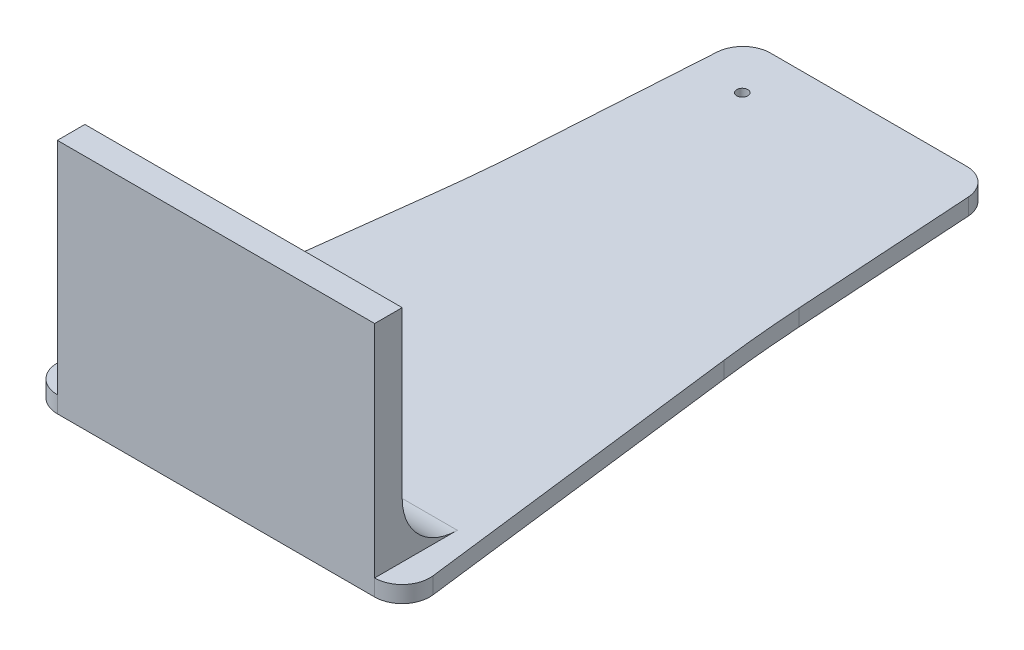
ISO-10303-21;
HEADER;
FILE_DESCRIPTION(('STEP AP214'),'2;1');
FILE_NAME('part.step','',(''),(''),'','','');
FILE_SCHEMA(('AUTOMOTIVE_DESIGN { 1 0 10303 214 1 1 1 1 }'));
ENDSEC;
DATA;
#1=APPLICATION_CONTEXT('core data for automotive mechanical design processes');
#2=APPLICATION_PROTOCOL_DEFINITION('international standard','automotive_design',2000,#1);
#3=PRODUCT_CONTEXT('',#1,'mechanical');
#4=PRODUCT('Part','Part','',(#3));
#5=PRODUCT_RELATED_PRODUCT_CATEGORY('part','',(#4));
#6=PRODUCT_DEFINITION_FORMATION('','',#4);
#7=PRODUCT_DEFINITION_CONTEXT('part definition',#1,'design');
#8=PRODUCT_DEFINITION('design','',#6,#7);
#9=PRODUCT_DEFINITION_SHAPE('','',#8);
#10=(LENGTH_UNIT() NAMED_UNIT(*) SI_UNIT(.MILLI.,.METRE.));
#11=(NAMED_UNIT(*) PLANE_ANGLE_UNIT() SI_UNIT($,.RADIAN.));
#12=(NAMED_UNIT(*) SI_UNIT($,.STERADIAN.) SOLID_ANGLE_UNIT());
#13=UNCERTAINTY_MEASURE_WITH_UNIT(LENGTH_MEASURE(1.E-05),#10,'distance_accuracy_value','');
#14=(GEOMETRIC_REPRESENTATION_CONTEXT(3) GLOBAL_UNCERTAINTY_ASSIGNED_CONTEXT((#13)) GLOBAL_UNIT_ASSIGNED_CONTEXT((#10,
#11,#12)) REPRESENTATION_CONTEXT('',''));
#15=CARTESIAN_POINT('',(0.,0.,0.));
#16=DIRECTION('',(0.,0.,1.));
#17=DIRECTION('',(1.,0.,0.));
#18=AXIS2_PLACEMENT_3D('',#15,#16,#17);
#19=CARTESIAN_POINT('',(-30.,3.,30.));
#20=DIRECTION('',(0.992397243349406,0.,0.123076039067315));
#21=DIRECTION('',(0.123076039067315,0.,-0.992397243349406));
#22=AXIS2_PLACEMENT_3D('',#19,#20,#21);
#23=PLANE('',#22);
#24=DIRECTION('',(-0.123076039067315,0.,0.992397243349406));
#25=VECTOR('',#24,1.);
#26=CARTESIAN_POINT('',(-30.,0.,30.));
#27=LINE('',#26,#25);
#28=CARTESIAN_POINT('',(-26.2750358818193,0.,-0.0354492269295376));
#29=VERTEX_POINT('',#28);
#30=CARTESIAN_POINT('',(-33.7621348966456,0.,60.3351678265958));
#31=VERTEX_POINT('',#30);
#32=EDGE_CURVE('E181',#29,#31,#27,.T.);
#33=ORIENTED_EDGE('',*,*,#32,.T.);
#34=DIRECTION('',(0.,-1.,0.));
#35=VECTOR('',#34,1.);
#36=CARTESIAN_POINT('',(-33.7621348966456,3.,60.3351678265958));
#37=LINE('',#36,#35);
#38=CARTESIAN_POINT('',(-33.7621348966459,3.,60.3351678265957));
#39=VERTEX_POINT('',#38);
#40=EDGE_CURVE('E261',#31,#39,#37,.F.);
#41=ORIENTED_EDGE('',*,*,#40,.T.);
#42=DIRECTION('',(-0.123076039067326,0.,0.992397243349405));
#43=VECTOR('',#42,1.);
#44=CARTESIAN_POINT('',(-25.3492903210335,3.,-7.50000000000001));
#45=LINE('',#44,#43);
#46=CARTESIAN_POINT('',(-26.275035881819,3.,-0.0354492269294959));
#47=VERTEX_POINT('',#46);
#48=EDGE_CURVE('E183',#47,#39,#45,.T.);
#49=ORIENTED_EDGE('',*,*,#48,.F.);
#50=DIRECTION('',(0.,-1.,0.));
#51=VECTOR('',#50,1.);
#52=CARTESIAN_POINT('',(-26.2750358818193,0.,-0.0354492269295371));
#53=LINE('',#52,#51);
#54=EDGE_CURVE('E217',#47,#29,#53,.T.);
#55=ORIENTED_EDGE('',*,*,#54,.T.);
#56=EDGE_LOOP('',(#33,#41,#49,#55));
#57=FACE_BOUND('',#56,.T.);
#58=ADVANCED_FACE('F37',(#57),#23,.F.);
#59=CARTESIAN_POINT('',(-30.,3.,65.9505480219323));
#60=DIRECTION('',(0.,0.,-1.));
#61=DIRECTION('',(-1.,0.,0.));
#62=AXIS2_PLACEMENT_3D('',#59,#60,#61);
#63=PLANE('',#62);
#64=DIRECTION('',(0.,-1.,0.));
#65=VECTOR('',#64,1.);
#66=CARTESIAN_POINT('',(28.8001486798989,3.,65.9505480219323));
#67=LINE('',#66,#65);
#68=CARTESIAN_POINT('',(28.8001486798989,0.,65.9505480219323));
#69=VERTEX_POINT('',#68);
#70=CARTESIAN_POINT('',(28.8001486798989,3.,65.9505480219323));
#71=VERTEX_POINT('',#70);
#72=EDGE_CURVE('E257',#69,#71,#67,.F.);
#73=ORIENTED_EDGE('',*,*,#72,.T.);
#74=DIRECTION('',(0.,-1.,0.));
#75=VECTOR('',#74,1.);
#76=CARTESIAN_POINT('',(28.8001486798989,43.,65.9505480219325));
#77=LINE('',#76,#75);
#78=CARTESIAN_POINT('',(28.8001486798989,43.,65.9505480219325));
#79=VERTEX_POINT('',#78);
#80=EDGE_CURVE('E156',#79,#71,#77,.T.);
#81=ORIENTED_EDGE('',*,*,#80,.F.);
#82=DIRECTION('',(1.,0.,0.));
#83=VECTOR('',#82,1.);
#84=CARTESIAN_POINT('',(-28.8001486798985,43.,65.9505480219325));
#85=LINE('',#84,#83);
#86=CARTESIAN_POINT('',(-28.8001486798985,43.,65.9505480219325));
#87=VERTEX_POINT('',#86);
#88=EDGE_CURVE('E149',#87,#79,#85,.T.);
#89=ORIENTED_EDGE('',*,*,#88,.F.);
#90=DIRECTION('',(0.,-1.,0.));
#91=VECTOR('',#90,1.);
#92=CARTESIAN_POINT('',(-28.8001486798985,43.,65.9505480219325));
#93=LINE('',#92,#91);
#94=CARTESIAN_POINT('',(-28.8001486798985,3.,65.9505480219323));
#95=VERTEX_POINT('',#94);
#96=EDGE_CURVE('E155',#87,#95,#93,.T.);
#97=ORIENTED_EDGE('',*,*,#96,.T.);
#98=DIRECTION('',(0.,-1.,0.));
#99=VECTOR('',#98,1.);
#100=CARTESIAN_POINT('',(-28.8001486798985,3.,65.9505480219323));
#101=LINE('',#100,#99);
#102=CARTESIAN_POINT('',(-28.8001486798985,0.,65.9505480219323));
#103=VERTEX_POINT('',#102);
#104=EDGE_CURVE('E259',#95,#103,#101,.T.);
#105=ORIENTED_EDGE('',*,*,#104,.T.);
#106=DIRECTION('',(1.,0.,0.));
#107=VECTOR('',#106,1.);
#108=CARTESIAN_POINT('',(-30.,0.,65.9505480219323));
#109=LINE('',#108,#107);
#110=EDGE_CURVE('E200',#103,#69,#109,.T.);
#111=ORIENTED_EDGE('',*,*,#110,.T.);
#112=EDGE_LOOP('',(#73,#81,#89,#97,#105,#111));
#113=FACE_BOUND('',#112,.T.);
#114=ADVANCED_FACE('F152',(#113),#63,.F.);
#115=CARTESIAN_POINT('',(25.3492903210335,3.,-7.50000000000001));
#116=DIRECTION('',(-0.992397243349405,0.,0.123076039067327));
#117=DIRECTION('',(0.123076039067327,0.,0.992397243349405));
#118=AXIS2_PLACEMENT_3D('',#115,#116,#117);
#119=PLANE('',#118);
#120=DIRECTION('',(-0.123076039067328,0.,-0.992397243349405));
#121=VECTOR('',#120,1.);
#122=CARTESIAN_POINT('',(30.,3.,30.));
#123=LINE('',#122,#121);
#124=CARTESIAN_POINT('',(33.762134896646,3.,60.3351678265957));
#125=VERTEX_POINT('',#124);
#126=CARTESIAN_POINT('',(26.2750358818201,3.,-0.035449226920458));
#127=VERTEX_POINT('',#126);
#128=EDGE_CURVE('E186',#125,#127,#123,.T.);
#129=ORIENTED_EDGE('',*,*,#128,.F.);
#130=DIRECTION('',(0.,-1.,0.));
#131=VECTOR('',#130,1.);
#132=CARTESIAN_POINT('',(33.7621348966459,3.,60.3351678265957));
#133=LINE('',#132,#131);
#134=CARTESIAN_POINT('',(33.7621348966459,0.,60.3351678265957));
#135=VERTEX_POINT('',#134);
#136=EDGE_CURVE('E263',#125,#135,#133,.T.);
#137=ORIENTED_EDGE('',*,*,#136,.T.);
#138=DIRECTION('',(-0.123076039067327,0.,-0.992397243349405));
#139=VECTOR('',#138,1.);
#140=CARTESIAN_POINT('',(25.3492903210335,0.,-7.50000000000001));
#141=LINE('',#140,#139);
#142=CARTESIAN_POINT('',(26.2750358818201,0.,-0.0354492269204676));
#143=VERTEX_POINT('',#142);
#144=EDGE_CURVE('E203',#135,#143,#141,.T.);
#145=ORIENTED_EDGE('',*,*,#144,.T.);
#146=DIRECTION('',(0.,-1.,0.));
#147=VECTOR('',#146,1.);
#148=CARTESIAN_POINT('',(26.2750358818201,3.,-0.0354492269204683));
#149=LINE('',#148,#147);
#150=EDGE_CURVE('E214',#143,#127,#149,.F.);
#151=ORIENTED_EDGE('',*,*,#150,.T.);
#152=EDGE_LOOP('',(#129,#137,#145,#151));
#153=FACE_BOUND('',#152,.T.);
#154=ADVANCED_FACE('F311',(#153),#119,.F.);
#155=CARTESIAN_POINT('',(22.5,3.,-52.5));
#156=DIRECTION('',(-0.998001450433273,0.,0.063191019402153));
#157=DIRECTION('',(0.063191019402153,0.,0.998001450433273));
#158=AXIS2_PLACEMENT_3D('',#155,#156,#157);
#159=PLANE('',#158);
#160=DIRECTION('',(-0.0631910194021531,0.,-0.998001450433273));
#161=VECTOR('',#160,1.);
#162=CARTESIAN_POINT('',(22.5,0.,-52.5));
#163=LINE('',#162,#161);
#164=CARTESIAN_POINT('',(24.873984110853,0.,-15.006704143214));
#165=VERTEX_POINT('',#164);
#166=CARTESIAN_POINT('',(22.7965823067861,0.,-47.8159550970108));
#167=VERTEX_POINT('',#166);
#168=EDGE_CURVE('E205',#165,#167,#163,.T.);
#169=ORIENTED_EDGE('',*,*,#168,.T.);
#170=DIRECTION('',(0.,-1.,0.));
#171=VECTOR('',#170,1.);
#172=CARTESIAN_POINT('',(22.7965823067861,3.,-47.8159550970108));
#173=LINE('',#172,#171);
#174=CARTESIAN_POINT('',(22.7965823067861,3.,-47.8159550970108));
#175=VERTEX_POINT('',#174);
#176=EDGE_CURVE('E266',#167,#175,#173,.F.);
#177=ORIENTED_EDGE('',*,*,#176,.T.);
#178=DIRECTION('',(-0.0631910194021531,0.,-0.998001450433273));
#179=VECTOR('',#178,1.);
#180=CARTESIAN_POINT('',(22.5,3.,-52.5));
#181=LINE('',#180,#179);
#182=CARTESIAN_POINT('',(24.873984110853,3.,-15.006704143214));
#183=VERTEX_POINT('',#182);
#184=EDGE_CURVE('E189',#183,#175,#181,.T.);
#185=ORIENTED_EDGE('',*,*,#184,.F.);
#186=DIRECTION('',(0.,-1.,0.));
#187=VECTOR('',#186,1.);
#188=CARTESIAN_POINT('',(24.873984110853,0.,-15.0067041432141));
#189=LINE('',#188,#187);
#190=EDGE_CURVE('E197',#183,#165,#189,.T.);
#191=ORIENTED_EDGE('',*,*,#190,.T.);
#192=EDGE_LOOP('',(#169,#177,#185,#191));
#193=FACE_BOUND('',#192,.T.);
#194=ADVANCED_FACE('F373',(#193),#159,.F.);
#195=CARTESIAN_POINT('',(-22.5,3.,-52.5));
#196=DIRECTION('',(0.,0.,1.));
#197=DIRECTION('',(1.,0.,0.));
#198=AXIS2_PLACEMENT_3D('',#195,#196,#197);
#199=PLANE('',#198);
#200=DIRECTION('',(-1.,0.,0.));
#201=VECTOR('',#200,1.);
#202=CARTESIAN_POINT('',(-22.5,0.,-52.5));
#203=LINE('',#202,#201);
#204=CARTESIAN_POINT('',(17.8065750546197,0.,-52.5));
#205=VERTEX_POINT('',#204);
#206=CARTESIAN_POINT('',(-17.8065750546197,0.,-52.5));
#207=VERTEX_POINT('',#206);
#208=EDGE_CURVE('E208',#205,#207,#203,.T.);
#209=ORIENTED_EDGE('',*,*,#208,.T.);
#210=DIRECTION('',(0.,-1.,0.));
#211=VECTOR('',#210,1.);
#212=CARTESIAN_POINT('',(-17.8065750546197,3.,-52.5));
#213=LINE('',#212,#211);
#214=CARTESIAN_POINT('',(-17.8065750546197,3.,-52.5));
#215=VERTEX_POINT('',#214);
#216=EDGE_CURVE('E247',#207,#215,#213,.F.);
#217=ORIENTED_EDGE('',*,*,#216,.T.);
#218=DIRECTION('',(-1.,0.,0.));
#219=VECTOR('',#218,1.);
#220=CARTESIAN_POINT('',(-22.5,3.,-52.5));
#221=LINE('',#220,#219);
#222=CARTESIAN_POINT('',(17.8065750546197,3.,-52.5));
#223=VERTEX_POINT('',#222);
#224=EDGE_CURVE('E192',#223,#215,#221,.T.);
#225=ORIENTED_EDGE('',*,*,#224,.F.);
#226=DIRECTION('',(0.,-1.,0.));
#227=VECTOR('',#226,1.);
#228=CARTESIAN_POINT('',(17.8065750546197,3.,-52.5));
#229=LINE('',#228,#227);
#230=EDGE_CURVE('E244',#223,#205,#229,.T.);
#231=ORIENTED_EDGE('',*,*,#230,.T.);
#232=EDGE_LOOP('',(#209,#217,#225,#231));
#233=FACE_BOUND('',#232,.T.);
#234=ADVANCED_FACE('F350',(#233),#199,.F.);
#235=CARTESIAN_POINT('',(-22.5,3.,-52.5));
#236=DIRECTION('',(0.998001450433273,0.,0.0631910194021544));
#237=DIRECTION('',(0.0631910194021544,0.,-0.998001450433273));
#238=AXIS2_PLACEMENT_3D('',#235,#236,#237);
#239=PLANE('',#238);
#240=DIRECTION('',(-0.0631910194021544,0.,0.998001450433273));
#241=VECTOR('',#240,1.);
#242=CARTESIAN_POINT('',(-22.5,3.,-52.5));
#243=LINE('',#242,#241);
#244=CARTESIAN_POINT('',(-22.7965823067861,3.,-47.8159550970108));
#245=VERTEX_POINT('',#244);
#246=CARTESIAN_POINT('',(-24.8739841108527,3.,-15.0067041432197));
#247=VERTEX_POINT('',#246);
#248=EDGE_CURVE('E195',#245,#247,#243,.T.);
#249=ORIENTED_EDGE('',*,*,#248,.F.);
#250=DIRECTION('',(0.,-1.,0.));
#251=VECTOR('',#250,1.);
#252=CARTESIAN_POINT('',(-22.7965823067861,3.,-47.8159550970108));
#253=LINE('',#252,#251);
#254=CARTESIAN_POINT('',(-22.7965823067861,0.,-47.8159550970108));
#255=VERTEX_POINT('',#254);
#256=EDGE_CURVE('E233',#245,#255,#253,.T.);
#257=ORIENTED_EDGE('',*,*,#256,.T.);
#258=DIRECTION('',(-0.0631910194021544,0.,0.998001450433273));
#259=VECTOR('',#258,1.);
#260=CARTESIAN_POINT('',(-22.5,0.,-52.5));
#261=LINE('',#260,#259);
#262=CARTESIAN_POINT('',(-24.8739841108527,0.,-15.0067041432197));
#263=VERTEX_POINT('',#262);
#264=EDGE_CURVE('E187',#255,#263,#261,.T.);
#265=ORIENTED_EDGE('',*,*,#264,.T.);
#266=DIRECTION('',(0.,-1.,0.));
#267=VECTOR('',#266,1.);
#268=CARTESIAN_POINT('',(-24.8739841108527,3.,-15.0067041432197));
#269=LINE('',#268,#267);
#270=EDGE_CURVE('E220',#263,#247,#269,.F.);
#271=ORIENTED_EDGE('',*,*,#270,.T.);
#272=EDGE_LOOP('',(#249,#257,#265,#271));
#273=FACE_BOUND('',#272,.T.);
#274=ADVANCED_FACE('F356',(#273),#239,.F.);
#275=CARTESIAN_POINT('',(0.,3.,0.));
#276=DIRECTION('',(0.,1.,0.));
#277=DIRECTION('',(0.,0.,1.));
#278=AXIS2_PLACEMENT_3D('',#275,#276,#277);
#279=PLANE('',#278);
#280=DIRECTION('',(0.,0.,1.));
#281=VECTOR('',#280,1.);
#282=CARTESIAN_POINT('',(-28.8001486798985,3.,65.9505480219325));
#283=LINE('',#282,#281);
#284=CARTESIAN_POINT('',(-28.8001486798985,3.,50.9505480219323));
#285=VERTEX_POINT('',#284);
#286=EDGE_CURVE('E52',#285,#95,#283,.T.);
#287=ORIENTED_EDGE('',*,*,#286,.F.);
#288=DIRECTION('',(-1.,0.,0.));
#289=VECTOR('',#288,1.);
#290=CARTESIAN_POINT('',(0.,3.,50.9505480219323));
#291=LINE('',#290,#289);
#292=CARTESIAN_POINT('',(28.8001486798989,3.,50.9505480219323));
#293=VERTEX_POINT('',#292);
#294=EDGE_CURVE('E271',#285,#293,#291,.F.);
#295=ORIENTED_EDGE('',*,*,#294,.T.);
#296=DIRECTION('',(0.,0.,-1.));
#297=VECTOR('',#296,1.);
#298=CARTESIAN_POINT('',(28.8001486798989,3.,65.9505480219325));
#299=LINE('',#298,#297);
#300=EDGE_CURVE('E59',#71,#293,#299,.T.);
#301=ORIENTED_EDGE('',*,*,#300,.F.);
#302=CARTESIAN_POINT('',(28.8001486798989,3.,60.9505480219323));
#303=DIRECTION('',(0.,1.,0.));
#304=DIRECTION('',(0.,0.,1.));
#305=AXIS2_PLACEMENT_3D('',#302,#303,#304);
#306=CIRCLE('',#305,5.);
#307=EDGE_CURVE('E251',#71,#125,#306,.T.);
#308=ORIENTED_EDGE('',*,*,#307,.T.);
#309=ORIENTED_EDGE('',*,*,#128,.T.);
#310=CARTESIAN_POINT('',(274.374346719171,3.,-30.8044589937523));
#311=DIRECTION('',(0.,1.,0.));
#312=DIRECTION('',(0.,0.,1.));
#313=AXIS2_PLACEMENT_3D('',#310,#311,#312);
#314=CIRCLE('',#313,250.);
#315=EDGE_CURVE('E226',#127,#183,#314,.F.);
#316=ORIENTED_EDGE('',*,*,#315,.T.);
#317=ORIENTED_EDGE('',*,*,#184,.T.);
#318=CARTESIAN_POINT('',(17.8065750546197,3.,-47.5));
#319=DIRECTION('',(0.,1.,0.));
#320=DIRECTION('',(0.,0.,1.));
#321=AXIS2_PLACEMENT_3D('',#318,#319,#320);
#322=CIRCLE('',#321,5.);
#323=EDGE_CURVE('E249',#175,#223,#322,.T.);
#324=ORIENTED_EDGE('',*,*,#323,.T.);
#325=ORIENTED_EDGE('',*,*,#224,.T.);
#326=CARTESIAN_POINT('',(-17.8065750546197,3.,-47.5));
#327=DIRECTION('',(0.,1.,0.));
#328=DIRECTION('',(0.,0.,1.));
#329=AXIS2_PLACEMENT_3D('',#326,#327,#328);
#330=CIRCLE('',#329,5.);
#331=EDGE_CURVE('E255',#215,#245,#330,.T.);
#332=ORIENTED_EDGE('',*,*,#331,.T.);
#333=ORIENTED_EDGE('',*,*,#248,.T.);
#334=CARTESIAN_POINT('',(-274.374346719171,3.,-30.8044589937583));
#335=DIRECTION('',(0.,1.,0.));
#336=DIRECTION('',(0.,0.,1.));
#337=AXIS2_PLACEMENT_3D('',#334,#335,#336);
#338=CIRCLE('',#337,250.);
#339=EDGE_CURVE('E231',#247,#47,#338,.F.);
#340=ORIENTED_EDGE('',*,*,#339,.T.);
#341=ORIENTED_EDGE('',*,*,#48,.T.);
#342=CARTESIAN_POINT('',(-28.8001486798985,3.,60.9505480219323));
#343=DIRECTION('',(0.,1.,0.));
#344=DIRECTION('',(0.,0.,1.));
#345=AXIS2_PLACEMENT_3D('',#342,#343,#344);
#346=CIRCLE('',#345,5.);
#347=EDGE_CURVE('E253',#39,#95,#346,.T.);
#348=ORIENTED_EDGE('',*,*,#347,.T.);
#349=EDGE_LOOP('',(#287,#295,#301,#308,#309,#316,#317,#324,#325,#332,#333,#340,#341,#348));
#350=FACE_BOUND('',#349,.T.);
#351=CARTESIAN_POINT('',(-14.115125166373,3.,-43.7022333236948));
#352=DIRECTION('',(0.,1.,0.));
#353=DIRECTION('',(0.,0.,1.));
#354=AXIS2_PLACEMENT_3D('',#351,#352,#353);
#355=CIRCLE('',#354,1.);
#356=CARTESIAN_POINT('',(-14.115125166373,3.,-42.7022333236948));
#357=VERTEX_POINT('',#356);
#358=EDGE_CURVE('E171',#357,#357,#355,.T.);
#359=ORIENTED_EDGE('',*,*,#358,.F.);
#360=EDGE_LOOP('',(#359));
#361=FACE_BOUND('',#360,.T.);
#362=ADVANCED_FACE('F277',(#350,#361),#279,.T.);
#363=CARTESIAN_POINT('',(0.,0.,0.));
#364=DIRECTION('',(0.,1.,0.));
#365=DIRECTION('',(0.,0.,1.));
#366=AXIS2_PLACEMENT_3D('',#363,#364,#365);
#367=PLANE('',#366);
#368=CARTESIAN_POINT('',(-14.115125166373,0.,-43.7022333236948));
#369=DIRECTION('',(0.,1.,0.));
#370=DIRECTION('',(0.,0.,1.));
#371=AXIS2_PLACEMENT_3D('',#368,#369,#370);
#372=CIRCLE('',#371,1.);
#373=CARTESIAN_POINT('',(-14.115125166373,0.,-42.7022333236948));
#374=VERTEX_POINT('',#373);
#375=EDGE_CURVE('E174',#374,#374,#372,.T.);
#376=ORIENTED_EDGE('',*,*,#375,.T.);
#377=EDGE_LOOP('',(#376));
#378=FACE_BOUND('',#377,.T.);
#379=ORIENTED_EDGE('',*,*,#264,.F.);
#380=CARTESIAN_POINT('',(-17.8065750546197,0.,-47.5));
#381=DIRECTION('',(0.,1.,0.));
#382=DIRECTION('',(0.,0.,1.));
#383=AXIS2_PLACEMENT_3D('',#380,#381,#382);
#384=CIRCLE('',#383,5.);
#385=EDGE_CURVE('E242',#255,#207,#384,.F.);
#386=ORIENTED_EDGE('',*,*,#385,.T.);
#387=ORIENTED_EDGE('',*,*,#208,.F.);
#388=CARTESIAN_POINT('',(17.8065750546197,0.,-47.5));
#389=DIRECTION('',(0.,1.,0.));
#390=DIRECTION('',(0.,0.,1.));
#391=AXIS2_PLACEMENT_3D('',#388,#389,#390);
#392=CIRCLE('',#391,5.);
#393=EDGE_CURVE('E236',#205,#167,#392,.F.);
#394=ORIENTED_EDGE('',*,*,#393,.T.);
#395=ORIENTED_EDGE('',*,*,#168,.F.);
#396=CARTESIAN_POINT('',(274.374346719171,0.,-30.8044589937523));
#397=DIRECTION('',(0.,1.,0.));
#398=DIRECTION('',(0.,0.,1.));
#399=AXIS2_PLACEMENT_3D('',#396,#397,#398);
#400=CIRCLE('',#399,250.);
#401=EDGE_CURVE('E223',#165,#143,#400,.T.);
#402=ORIENTED_EDGE('',*,*,#401,.T.);
#403=ORIENTED_EDGE('',*,*,#144,.F.);
#404=CARTESIAN_POINT('',(28.8001486798989,0.,60.9505480219323));
#405=DIRECTION('',(0.,1.,0.));
#406=DIRECTION('',(0.,0.,1.));
#407=AXIS2_PLACEMENT_3D('',#404,#405,#406);
#408=CIRCLE('',#407,5.);
#409=EDGE_CURVE('E238',#135,#69,#408,.F.);
#410=ORIENTED_EDGE('',*,*,#409,.T.);
#411=ORIENTED_EDGE('',*,*,#110,.F.);
#412=CARTESIAN_POINT('',(-28.8001486798985,0.,60.9505480219323));
#413=DIRECTION('',(0.,1.,0.));
#414=DIRECTION('',(0.,0.,1.));
#415=AXIS2_PLACEMENT_3D('',#412,#413,#414);
#416=CIRCLE('',#415,5.);
#417=EDGE_CURVE('E240',#103,#31,#416,.F.);
#418=ORIENTED_EDGE('',*,*,#417,.T.);
#419=ORIENTED_EDGE('',*,*,#32,.F.);
#420=CARTESIAN_POINT('',(-274.374346719171,0.,-30.8044589937583));
#421=DIRECTION('',(0.,1.,0.));
#422=DIRECTION('',(0.,0.,1.));
#423=AXIS2_PLACEMENT_3D('',#420,#421,#422);
#424=CIRCLE('',#423,250.);
#425=EDGE_CURVE('E228',#29,#263,#424,.T.);
#426=ORIENTED_EDGE('',*,*,#425,.T.);
#427=EDGE_LOOP('',(#379,#386,#387,#394,#395,#402,#403,#410,#411,#418,#419,#426));
#428=FACE_BOUND('',#427,.T.);
#429=ADVANCED_FACE('F319',(#378,#428),#367,.F.);
#430=CARTESIAN_POINT('',(274.374346719171,3.,-30.8044589937523));
#431=DIRECTION('',(0.,1.,0.));
#432=DIRECTION('',(0.,0.,1.));
#433=AXIS2_PLACEMENT_3D('',#430,#431,#432);
#434=CYLINDRICAL_SURFACE('',#433,250.);
#435=ORIENTED_EDGE('',*,*,#315,.F.);
#436=ORIENTED_EDGE('',*,*,#150,.F.);
#437=ORIENTED_EDGE('',*,*,#401,.F.);
#438=ORIENTED_EDGE('',*,*,#190,.F.);
#439=EDGE_LOOP('',(#435,#436,#437,#438));
#440=FACE_BOUND('',#439,.T.);
#441=ADVANCED_FACE('F315',(#440),#434,.F.);
#442=CARTESIAN_POINT('',(-274.374346719171,3.,-30.8044589937583));
#443=DIRECTION('',(0.,1.,0.));
#444=DIRECTION('',(0.,0.,1.));
#445=AXIS2_PLACEMENT_3D('',#442,#443,#444);
#446=CYLINDRICAL_SURFACE('',#445,250.);
#447=ORIENTED_EDGE('',*,*,#339,.F.);
#448=ORIENTED_EDGE('',*,*,#270,.F.);
#449=ORIENTED_EDGE('',*,*,#425,.F.);
#450=ORIENTED_EDGE('',*,*,#54,.F.);
#451=EDGE_LOOP('',(#447,#448,#449,#450));
#452=FACE_BOUND('',#451,.T.);
#453=ADVANCED_FACE('F318',(#452),#446,.F.);
#454=CARTESIAN_POINT('',(-17.8065750546197,3.,-47.5));
#455=DIRECTION('',(0.,-1.,0.));
#456=DIRECTION('',(0.,0.,-1.));
#457=AXIS2_PLACEMENT_3D('',#454,#455,#456);
#458=CYLINDRICAL_SURFACE('',#457,5.);
#459=ORIENTED_EDGE('',*,*,#331,.F.);
#460=ORIENTED_EDGE('',*,*,#216,.F.);
#461=ORIENTED_EDGE('',*,*,#385,.F.);
#462=ORIENTED_EDGE('',*,*,#256,.F.);
#463=EDGE_LOOP('',(#459,#460,#461,#462));
#464=FACE_BOUND('',#463,.T.);
#465=ADVANCED_FACE('F323',(#464),#458,.T.);
#466=CARTESIAN_POINT('',(-28.8001486798985,3.,60.9505480219323));
#467=DIRECTION('',(0.,-1.,0.));
#468=DIRECTION('',(0.,0.,-1.));
#469=AXIS2_PLACEMENT_3D('',#466,#467,#468);
#470=CYLINDRICAL_SURFACE('',#469,5.);
#471=ORIENTED_EDGE('',*,*,#347,.F.);
#472=ORIENTED_EDGE('',*,*,#40,.F.);
#473=ORIENTED_EDGE('',*,*,#417,.F.);
#474=ORIENTED_EDGE('',*,*,#104,.F.);
#475=EDGE_LOOP('',(#471,#472,#473,#474));
#476=FACE_BOUND('',#475,.T.);
#477=ADVANCED_FACE('F327',(#476),#470,.T.);
#478=CARTESIAN_POINT('',(28.8001486798989,3.,60.9505480219323));
#479=DIRECTION('',(0.,-1.,0.));
#480=DIRECTION('',(0.,0.,-1.));
#481=AXIS2_PLACEMENT_3D('',#478,#479,#480);
#482=CYLINDRICAL_SURFACE('',#481,5.);
#483=ORIENTED_EDGE('',*,*,#307,.F.);
#484=ORIENTED_EDGE('',*,*,#72,.F.);
#485=ORIENTED_EDGE('',*,*,#409,.F.);
#486=ORIENTED_EDGE('',*,*,#136,.F.);
#487=EDGE_LOOP('',(#483,#484,#485,#486));
#488=FACE_BOUND('',#487,.T.);
#489=ADVANCED_FACE('F286',(#488),#482,.T.);
#490=CARTESIAN_POINT('',(17.8065750546197,3.,-47.5));
#491=DIRECTION('',(0.,-1.,0.));
#492=DIRECTION('',(0.,0.,-1.));
#493=AXIS2_PLACEMENT_3D('',#490,#491,#492);
#494=CYLINDRICAL_SURFACE('',#493,5.);
#495=ORIENTED_EDGE('',*,*,#323,.F.);
#496=ORIENTED_EDGE('',*,*,#176,.F.);
#497=ORIENTED_EDGE('',*,*,#393,.F.);
#498=ORIENTED_EDGE('',*,*,#230,.F.);
#499=EDGE_LOOP('',(#495,#496,#497,#498));
#500=FACE_BOUND('',#499,.T.);
#501=ADVANCED_FACE('F333',(#500),#494,.T.);
#502=CARTESIAN_POINT('',(-14.115125166373,0.,-43.7022333236948));
#503=DIRECTION('',(0.,1.,0.));
#504=DIRECTION('',(0.,0.,1.));
#505=AXIS2_PLACEMENT_3D('',#502,#503,#504);
#506=CYLINDRICAL_SURFACE('',#505,1.);
#507=ORIENTED_EDGE('',*,*,#375,.F.);
#508=EDGE_LOOP('',(#507));
#509=FACE_BOUND('',#508,.T.);
#510=ORIENTED_EDGE('',*,*,#358,.T.);
#511=EDGE_LOOP('',(#510));
#512=FACE_BOUND('',#511,.T.);
#513=ADVANCED_FACE('F335',(#509,#512),#506,.F.);
#514=CARTESIAN_POINT('',(-28.8001486798985,43.,65.9505480219325));
#515=DIRECTION('',(1.,0.,0.));
#516=DIRECTION('',(0.,0.,-1.));
#517=AXIS2_PLACEMENT_3D('',#514,#515,#516);
#518=PLANE('',#517);
#519=ORIENTED_EDGE('',*,*,#286,.T.);
#520=ORIENTED_EDGE('',*,*,#96,.F.);
#521=DIRECTION('',(0.,0.,1.));
#522=VECTOR('',#521,1.);
#523=CARTESIAN_POINT('',(-28.8001486798985,43.,65.9505480219325));
#524=LINE('',#523,#522);
#525=CARTESIAN_POINT('',(-28.8001486798985,43.,60.9505480219323));
#526=VERTEX_POINT('',#525);
#527=EDGE_CURVE('E160',#526,#87,#524,.T.);
#528=ORIENTED_EDGE('',*,*,#527,.F.);
#529=DIRECTION('',(0.,-1.,0.));
#530=VECTOR('',#529,1.);
#531=CARTESIAN_POINT('',(-28.8001486798985,43.,60.9505480219323));
#532=LINE('',#531,#530);
#533=CARTESIAN_POINT('',(-28.8001486798985,13.,60.9505480219323));
#534=VERTEX_POINT('',#533);
#535=EDGE_CURVE('E273',#526,#534,#532,.T.);
#536=ORIENTED_EDGE('',*,*,#535,.T.);
#537=CARTESIAN_POINT('',(-28.8001486798985,13.,50.9505480219323));
#538=DIRECTION('',(1.,0.,0.));
#539=DIRECTION('',(0.,0.,-1.));
#540=AXIS2_PLACEMENT_3D('',#537,#538,#539);
#541=CIRCLE('',#540,10.);
#542=EDGE_CURVE('E45',#534,#285,#541,.T.);
#543=ORIENTED_EDGE('',*,*,#542,.T.);
#544=EDGE_LOOP('',(#519,#520,#528,#536,#543));
#545=FACE_BOUND('',#544,.T.);
#546=ADVANCED_FACE('F170',(#545),#518,.F.);
#547=CARTESIAN_POINT('',(28.8001486798989,43.,65.9505480219325));
#548=DIRECTION('',(-1.,0.,0.));
#549=DIRECTION('',(0.,0.,1.));
#550=AXIS2_PLACEMENT_3D('',#547,#548,#549);
#551=PLANE('',#550);
#552=ORIENTED_EDGE('',*,*,#300,.T.);
#553=CARTESIAN_POINT('',(28.8001486798989,13.,50.9505480219323));
#554=DIRECTION('',(-1.,0.,0.));
#555=DIRECTION('',(0.,0.,1.));
#556=AXIS2_PLACEMENT_3D('',#553,#554,#555);
#557=CIRCLE('',#556,10.);
#558=CARTESIAN_POINT('',(28.8001486798989,13.,60.9505480219323));
#559=VERTEX_POINT('',#558);
#560=EDGE_CURVE('E11',#293,#559,#557,.T.);
#561=ORIENTED_EDGE('',*,*,#560,.T.);
#562=DIRECTION('',(0.,-1.,0.));
#563=VECTOR('',#562,1.);
#564=CARTESIAN_POINT('',(28.8001486798989,43.,60.9505480219323));
#565=LINE('',#564,#563);
#566=CARTESIAN_POINT('',(28.8001486798989,43.,60.9505480219323));
#567=VERTEX_POINT('',#566);
#568=EDGE_CURVE('E176',#567,#559,#565,.T.);
#569=ORIENTED_EDGE('',*,*,#568,.F.);
#570=DIRECTION('',(0.,0.,-1.));
#571=VECTOR('',#570,1.);
#572=CARTESIAN_POINT('',(28.8001486798989,43.,65.9505480219325));
#573=LINE('',#572,#571);
#574=EDGE_CURVE('E159',#79,#567,#573,.T.);
#575=ORIENTED_EDGE('',*,*,#574,.F.);
#576=ORIENTED_EDGE('',*,*,#80,.T.);
#577=EDGE_LOOP('',(#552,#561,#569,#575,#576));
#578=FACE_BOUND('',#577,.T.);
#579=ADVANCED_FACE('F287',(#578),#551,.F.);
#580=CARTESIAN_POINT('',(-28.8001486798985,43.,60.9505480219323));
#581=DIRECTION('',(0.,0.,1.));
#582=DIRECTION('',(1.,0.,0.));
#583=AXIS2_PLACEMENT_3D('',#580,#581,#582);
#584=PLANE('',#583);
#585=ORIENTED_EDGE('',*,*,#568,.T.);
#586=DIRECTION('',(-1.,0.,0.));
#587=VECTOR('',#586,1.);
#588=CARTESIAN_POINT('',(-28.8001486798985,13.,60.9505480219323));
#589=LINE('',#588,#587);
#590=EDGE_CURVE('E268',#559,#534,#589,.T.);
#591=ORIENTED_EDGE('',*,*,#590,.T.);
#592=ORIENTED_EDGE('',*,*,#535,.F.);
#593=DIRECTION('',(-1.,0.,0.));
#594=VECTOR('',#593,1.);
#595=CARTESIAN_POINT('',(-28.8001486798985,43.,60.9505480219323));
#596=LINE('',#595,#594);
#597=EDGE_CURVE('E165',#567,#526,#596,.T.);
#598=ORIENTED_EDGE('',*,*,#597,.F.);
#599=EDGE_LOOP('',(#585,#591,#592,#598));
#600=FACE_BOUND('',#599,.T.);
#601=ADVANCED_FACE('F295',(#600),#584,.F.);
#602=CARTESIAN_POINT('',(0.,43.,0.));
#603=DIRECTION('',(0.,-1.,0.));
#604=DIRECTION('',(0.,0.,-1.));
#605=AXIS2_PLACEMENT_3D('',#602,#603,#604);
#606=PLANE('',#605);
#607=ORIENTED_EDGE('',*,*,#527,.T.);
#608=ORIENTED_EDGE('',*,*,#88,.T.);
#609=ORIENTED_EDGE('',*,*,#574,.T.);
#610=ORIENTED_EDGE('',*,*,#597,.T.);
#611=EDGE_LOOP('',(#607,#608,#609,#610));
#612=FACE_BOUND('',#611,.T.);
#613=ADVANCED_FACE('F163',(#612),#606,.F.);
#614=CARTESIAN_POINT('',(-28.8001486798985,13.,50.9505480219323));
#615=DIRECTION('',(-1.,0.,0.));
#616=DIRECTION('',(0.,0.,1.));
#617=AXIS2_PLACEMENT_3D('',#614,#615,#616);
#618=CYLINDRICAL_SURFACE('',#617,10.);
#619=ORIENTED_EDGE('',*,*,#560,.F.);
#620=ORIENTED_EDGE('',*,*,#294,.F.);
#621=ORIENTED_EDGE('',*,*,#542,.F.);
#622=ORIENTED_EDGE('',*,*,#590,.F.);
#623=EDGE_LOOP('',(#619,#620,#621,#622));
#624=FACE_BOUND('',#623,.T.);
#625=ADVANCED_FACE('F39',(#624),#618,.F.);
#626=CLOSED_SHELL('',(#58,#114,#154,#194,#234,#274,#362,#429,#441,#453,#465,#477,#489,#501,#513,
#546,#579,#601,#613,#625));
#627=MANIFOLD_SOLID_BREP('B2',#626);
#628=ADVANCED_BREP_SHAPE_REPRESENTATION('',(#18,#627),#14);
#629=SHAPE_DEFINITION_REPRESENTATION(#9,#628);
ENDSEC;
END-ISO-10303-21;
